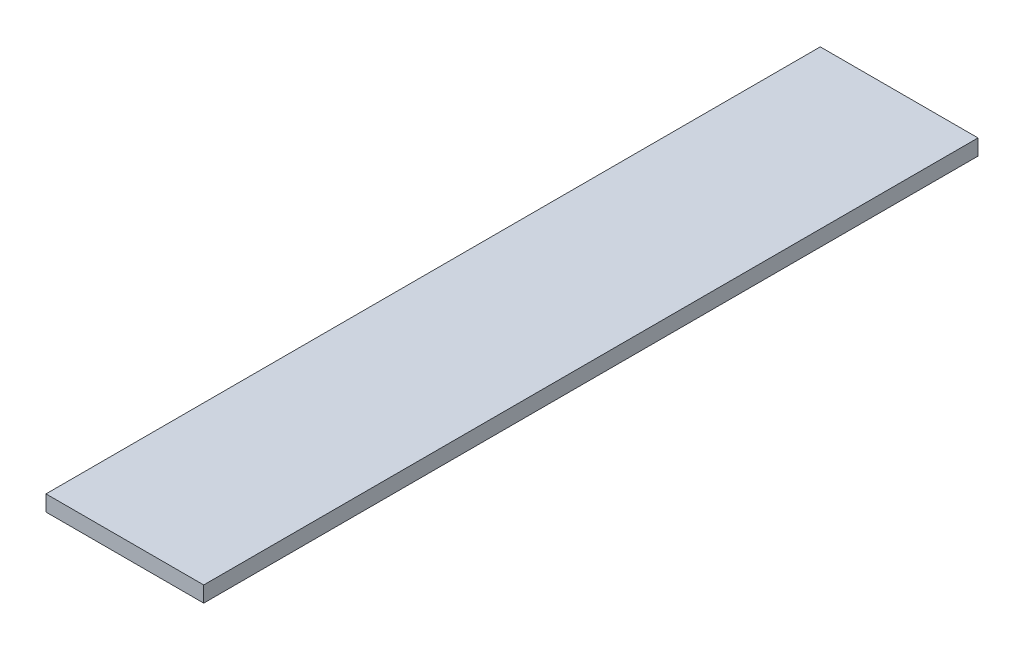
ISO-10303-21;
HEADER;
FILE_DESCRIPTION(('STEP AP214'),'2;1');
FILE_NAME('part.step','',(''),(''),'','','');
FILE_SCHEMA(('AUTOMOTIVE_DESIGN { 1 0 10303 214 1 1 1 1 }'));
ENDSEC;
DATA;
#1=APPLICATION_CONTEXT('core data for automotive mechanical design processes');
#2=APPLICATION_PROTOCOL_DEFINITION('international standard','automotive_design',2000,#1);
#3=PRODUCT_CONTEXT('',#1,'mechanical');
#4=PRODUCT('Part','Part','',(#3));
#5=PRODUCT_RELATED_PRODUCT_CATEGORY('part','',(#4));
#6=PRODUCT_DEFINITION_FORMATION('','',#4);
#7=PRODUCT_DEFINITION_CONTEXT('part definition',#1,'design');
#8=PRODUCT_DEFINITION('design','',#6,#7);
#9=PRODUCT_DEFINITION_SHAPE('','',#8);
#10=(LENGTH_UNIT() NAMED_UNIT(*) SI_UNIT(.MILLI.,.METRE.));
#11=(NAMED_UNIT(*) PLANE_ANGLE_UNIT() SI_UNIT($,.RADIAN.));
#12=(NAMED_UNIT(*) SI_UNIT($,.STERADIAN.) SOLID_ANGLE_UNIT());
#13=UNCERTAINTY_MEASURE_WITH_UNIT(LENGTH_MEASURE(1.E-05),#10,'distance_accuracy_value','');
#14=(GEOMETRIC_REPRESENTATION_CONTEXT(3) GLOBAL_UNCERTAINTY_ASSIGNED_CONTEXT((#13)) GLOBAL_UNIT_ASSIGNED_CONTEXT((#10,
#11,#12)) REPRESENTATION_CONTEXT('',''));
#15=CARTESIAN_POINT('',(0.,0.,0.));
#16=DIRECTION('',(0.,0.,1.));
#17=DIRECTION('',(1.,0.,0.));
#18=AXIS2_PLACEMENT_3D('',#15,#16,#17);
#19=CARTESIAN_POINT('',(0.,0.,245.45));
#20=DIRECTION('',(1.,0.,0.));
#21=DIRECTION('',(0.,0.,-1.));
#22=AXIS2_PLACEMENT_3D('',#19,#20,#21);
#23=PLANE('',#22);
#24=DIRECTION('',(0.,-1.,0.));
#25=VECTOR('',#24,1.);
#26=CARTESIAN_POINT('',(0.,0.,0.));
#27=LINE('',#26,#25);
#28=CARTESIAN_POINT('',(0.,5.,0.));
#29=VERTEX_POINT('',#28);
#30=CARTESIAN_POINT('',(0.,0.,0.));
#31=VERTEX_POINT('',#30);
#32=EDGE_CURVE('E95',#29,#31,#27,.T.);
#33=ORIENTED_EDGE('',*,*,#32,.T.);
#34=DIRECTION('',(0.,0.,-1.));
#35=VECTOR('',#34,1.);
#36=CARTESIAN_POINT('',(0.,0.,245.45));
#37=LINE('',#36,#35);
#38=CARTESIAN_POINT('',(0.,0.,245.45));
#39=VERTEX_POINT('',#38);
#40=EDGE_CURVE('E11',#39,#31,#37,.T.);
#41=ORIENTED_EDGE('',*,*,#40,.F.);
#42=DIRECTION('',(0.,-1.,0.));
#43=VECTOR('',#42,1.);
#44=CARTESIAN_POINT('',(0.,0.,245.45));
#45=LINE('',#44,#43);
#46=CARTESIAN_POINT('',(0.,5.,245.45));
#47=VERTEX_POINT('',#46);
#48=EDGE_CURVE('E83',#47,#39,#45,.T.);
#49=ORIENTED_EDGE('',*,*,#48,.F.);
#50=DIRECTION('',(0.,0.,-1.));
#51=VECTOR('',#50,1.);
#52=CARTESIAN_POINT('',(0.,5.,245.45));
#53=LINE('',#52,#51);
#54=EDGE_CURVE('E91',#47,#29,#53,.T.);
#55=ORIENTED_EDGE('',*,*,#54,.T.);
#56=EDGE_LOOP('',(#33,#41,#49,#55));
#57=FACE_BOUND('',#56,.T.);
#58=ADVANCED_FACE('F32',(#57),#23,.F.);
#59=CARTESIAN_POINT('',(0.,0.,245.45));
#60=DIRECTION('',(0.,1.,0.));
#61=DIRECTION('',(0.,0.,1.));
#62=AXIS2_PLACEMENT_3D('',#59,#60,#61);
#63=PLANE('',#62);
#64=DIRECTION('',(1.,0.,0.));
#65=VECTOR('',#64,1.);
#66=CARTESIAN_POINT('',(0.,0.,0.));
#67=LINE('',#66,#65);
#68=CARTESIAN_POINT('',(50.,0.,0.));
#69=VERTEX_POINT('',#68);
#70=EDGE_CURVE('E87',#31,#69,#67,.T.);
#71=ORIENTED_EDGE('',*,*,#70,.T.);
#72=DIRECTION('',(0.,0.,-1.));
#73=VECTOR('',#72,1.);
#74=CARTESIAN_POINT('',(50.,0.,245.45));
#75=LINE('',#74,#73);
#76=CARTESIAN_POINT('',(50.,0.,245.45));
#77=VERTEX_POINT('',#76);
#78=EDGE_CURVE('E40',#77,#69,#75,.T.);
#79=ORIENTED_EDGE('',*,*,#78,.F.);
#80=DIRECTION('',(1.,0.,0.));
#81=VECTOR('',#80,1.);
#82=CARTESIAN_POINT('',(0.,0.,245.45));
#83=LINE('',#82,#81);
#84=EDGE_CURVE('E78',#39,#77,#83,.T.);
#85=ORIENTED_EDGE('',*,*,#84,.F.);
#86=ORIENTED_EDGE('',*,*,#40,.T.);
#87=EDGE_LOOP('',(#71,#79,#85,#86));
#88=FACE_BOUND('',#87,.T.);
#89=ADVANCED_FACE('F86',(#88),#63,.F.);
#90=CARTESIAN_POINT('',(50.,0.,245.45));
#91=DIRECTION('',(-1.,0.,0.));
#92=DIRECTION('',(0.,0.,1.));
#93=AXIS2_PLACEMENT_3D('',#90,#91,#92);
#94=PLANE('',#93);
#95=DIRECTION('',(0.,1.,0.));
#96=VECTOR('',#95,1.);
#97=CARTESIAN_POINT('',(50.,0.,0.));
#98=LINE('',#97,#96);
#99=CARTESIAN_POINT('',(50.,5.,0.));
#100=VERTEX_POINT('',#99);
#101=EDGE_CURVE('E65',#69,#100,#98,.T.);
#102=ORIENTED_EDGE('',*,*,#101,.T.);
#103=DIRECTION('',(0.,0.,-1.));
#104=VECTOR('',#103,1.);
#105=CARTESIAN_POINT('',(50.,5.,245.45));
#106=LINE('',#105,#104);
#107=CARTESIAN_POINT('',(50.,5.,245.45));
#108=VERTEX_POINT('',#107);
#109=EDGE_CURVE('E88',#108,#100,#106,.T.);
#110=ORIENTED_EDGE('',*,*,#109,.F.);
#111=DIRECTION('',(0.,1.,0.));
#112=VECTOR('',#111,1.);
#113=CARTESIAN_POINT('',(50.,0.,245.45));
#114=LINE('',#113,#112);
#115=EDGE_CURVE('E81',#77,#108,#114,.T.);
#116=ORIENTED_EDGE('',*,*,#115,.F.);
#117=ORIENTED_EDGE('',*,*,#78,.T.);
#118=EDGE_LOOP('',(#102,#110,#116,#117));
#119=FACE_BOUND('',#118,.T.);
#120=ADVANCED_FACE('F89',(#119),#94,.F.);
#121=CARTESIAN_POINT('',(0.,5.,245.45));
#122=DIRECTION('',(0.,-1.,0.));
#123=DIRECTION('',(0.,0.,-1.));
#124=AXIS2_PLACEMENT_3D('',#121,#122,#123);
#125=PLANE('',#124);
#126=DIRECTION('',(-1.,0.,0.));
#127=VECTOR('',#126,1.);
#128=CARTESIAN_POINT('',(0.,5.,0.));
#129=LINE('',#128,#127);
#130=EDGE_CURVE('E71',#100,#29,#129,.T.);
#131=ORIENTED_EDGE('',*,*,#130,.T.);
#132=ORIENTED_EDGE('',*,*,#54,.F.);
#133=DIRECTION('',(-1.,0.,0.));
#134=VECTOR('',#133,1.);
#135=CARTESIAN_POINT('',(0.,5.,245.45));
#136=LINE('',#135,#134);
#137=EDGE_CURVE('E48',#108,#47,#136,.T.);
#138=ORIENTED_EDGE('',*,*,#137,.F.);
#139=ORIENTED_EDGE('',*,*,#109,.T.);
#140=EDGE_LOOP('',(#131,#132,#138,#139));
#141=FACE_BOUND('',#140,.T.);
#142=ADVANCED_FACE('F102',(#141),#125,.F.);
#143=CARTESIAN_POINT('',(0.,0.,245.45));
#144=DIRECTION('',(0.,0.,-1.));
#145=DIRECTION('',(-1.,0.,0.));
#146=AXIS2_PLACEMENT_3D('',#143,#144,#145);
#147=PLANE('',#146);
#148=ORIENTED_EDGE('',*,*,#48,.T.);
#149=ORIENTED_EDGE('',*,*,#84,.T.);
#150=ORIENTED_EDGE('',*,*,#115,.T.);
#151=ORIENTED_EDGE('',*,*,#137,.T.);
#152=EDGE_LOOP('',(#148,#149,#150,#151));
#153=FACE_BOUND('',#152,.T.);
#154=ADVANCED_FACE('F79',(#153),#147,.F.);
#155=CARTESIAN_POINT('',(0.,0.,0.));
#156=DIRECTION('',(0.,0.,-1.));
#157=DIRECTION('',(-1.,0.,0.));
#158=AXIS2_PLACEMENT_3D('',#155,#156,#157);
#159=PLANE('',#158);
#160=ORIENTED_EDGE('',*,*,#32,.F.);
#161=ORIENTED_EDGE('',*,*,#130,.F.);
#162=ORIENTED_EDGE('',*,*,#101,.F.);
#163=ORIENTED_EDGE('',*,*,#70,.F.);
#164=EDGE_LOOP('',(#160,#161,#162,#163));
#165=FACE_BOUND('',#164,.T.);
#166=ADVANCED_FACE('F105',(#165),#159,.T.);
#167=CLOSED_SHELL('',(#58,#89,#120,#142,#154,#166));
#168=MANIFOLD_SOLID_BREP('B2',#167);
#169=ADVANCED_BREP_SHAPE_REPRESENTATION('',(#18,#168),#14);
#170=SHAPE_DEFINITION_REPRESENTATION(#9,#169);
ENDSEC;
END-ISO-10303-21;
